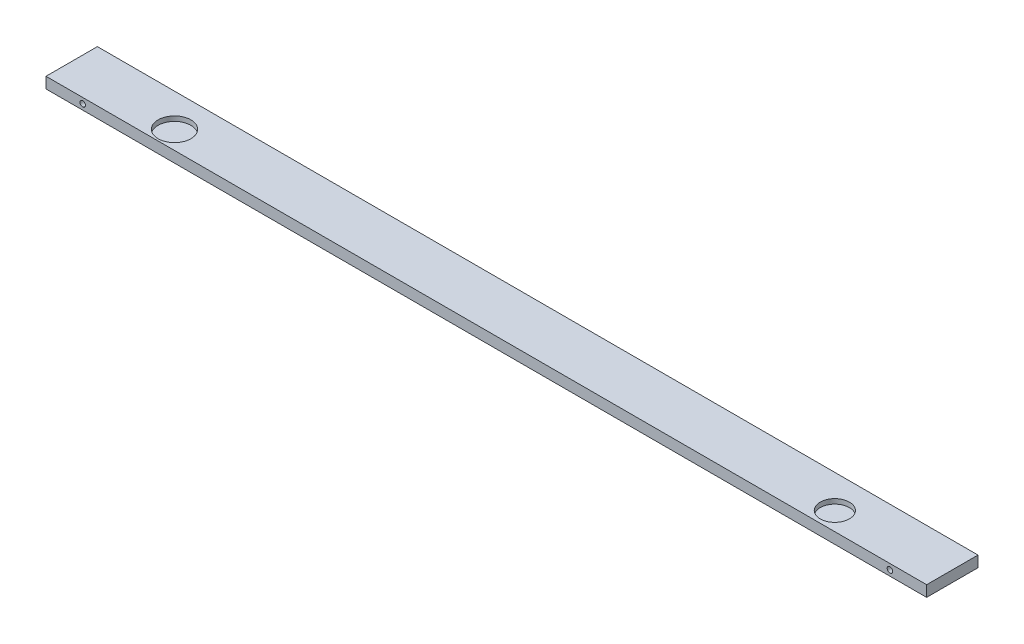
ISO-10303-21;
HEADER;
FILE_DESCRIPTION(('STEP AP214'),'2;1');
FILE_NAME('part.step','',(''),(''),'','','');
FILE_SCHEMA(('AUTOMOTIVE_DESIGN { 1 0 10303 214 1 1 1 1 }'));
ENDSEC;
DATA;
#1=APPLICATION_CONTEXT('core data for automotive mechanical design processes');
#2=APPLICATION_PROTOCOL_DEFINITION('international standard','automotive_design',2000,#1);
#3=PRODUCT_CONTEXT('',#1,'mechanical');
#4=PRODUCT('Part','Part','',(#3));
#5=PRODUCT_RELATED_PRODUCT_CATEGORY('part','',(#4));
#6=PRODUCT_DEFINITION_FORMATION('','',#4);
#7=PRODUCT_DEFINITION_CONTEXT('part definition',#1,'design');
#8=PRODUCT_DEFINITION('design','',#6,#7);
#9=PRODUCT_DEFINITION_SHAPE('','',#8);
#10=(LENGTH_UNIT() NAMED_UNIT(*) SI_UNIT(.MILLI.,.METRE.));
#11=(NAMED_UNIT(*) PLANE_ANGLE_UNIT() SI_UNIT($,.RADIAN.));
#12=(NAMED_UNIT(*) SI_UNIT($,.STERADIAN.) SOLID_ANGLE_UNIT());
#13=UNCERTAINTY_MEASURE_WITH_UNIT(LENGTH_MEASURE(1.E-05),#10,'distance_accuracy_value','');
#14=(GEOMETRIC_REPRESENTATION_CONTEXT(3) GLOBAL_UNCERTAINTY_ASSIGNED_CONTEXT((#13)) GLOBAL_UNIT_ASSIGNED_CONTEXT((#10,
#11,#12)) REPRESENTATION_CONTEXT('',''));
#15=CARTESIAN_POINT('',(0.,0.,0.));
#16=DIRECTION('',(0.,0.,1.));
#17=DIRECTION('',(1.,0.,0.));
#18=AXIS2_PLACEMENT_3D('',#15,#16,#17);
#19=CARTESIAN_POINT('',(120.,3.,-7.00000000000001));
#20=DIRECTION('',(0.,0.,1.));
#21=DIRECTION('',(1.,0.,0.));
#22=AXIS2_PLACEMENT_3D('',#19,#20,#21);
#23=PLANE('',#22);
#24=CARTESIAN_POINT('',(110.,1.5,-7.00000000000001));
#25=DIRECTION('',(0.,0.,-1.));
#26=DIRECTION('',(-1.,0.,0.));
#27=AXIS2_PLACEMENT_3D('',#24,#25,#26);
#28=CIRCLE('',#27,0.749999999999999);
#29=CARTESIAN_POINT('',(109.25,1.5,-7.00000000000001));
#30=VERTEX_POINT('',#29);
#31=EDGE_CURVE('E156',#30,#30,#28,.T.);
#32=ORIENTED_EDGE('',*,*,#31,.F.);
#33=EDGE_LOOP('',(#32));
#34=FACE_BOUND('',#33,.T.);
#35=CARTESIAN_POINT('',(-110.,1.5,-6.99999999999998));
#36=DIRECTION('',(0.,0.,-1.));
#37=DIRECTION('',(1.,0.,0.));
#38=AXIS2_PLACEMENT_3D('',#35,#36,#37);
#39=CIRCLE('',#38,0.749999999999999);
#40=CARTESIAN_POINT('',(-109.25,1.5,-6.99999999999998));
#41=VERTEX_POINT('',#40);
#42=EDGE_CURVE('E159',#41,#41,#39,.T.);
#43=ORIENTED_EDGE('',*,*,#42,.F.);
#44=EDGE_LOOP('',(#43));
#45=FACE_BOUND('',#44,.T.);
#46=DIRECTION('',(-1.,0.,0.));
#47=VECTOR('',#46,1.);
#48=CARTESIAN_POINT('',(120.,0.,-7.00000000000001));
#49=LINE('',#48,#47);
#50=CARTESIAN_POINT('',(120.,0.,-7.00000000000001));
#51=VERTEX_POINT('',#50);
#52=CARTESIAN_POINT('',(-120.,0.,-6.99999999999998));
#53=VERTEX_POINT('',#52);
#54=EDGE_CURVE('E112',#51,#53,#49,.T.);
#55=ORIENTED_EDGE('',*,*,#54,.T.);
#56=DIRECTION('',(0.,-1.,0.));
#57=VECTOR('',#56,1.);
#58=CARTESIAN_POINT('',(-120.,3.,-6.99999999999998));
#59=LINE('',#58,#57);
#60=CARTESIAN_POINT('',(-120.,3.,-6.99999999999998));
#61=VERTEX_POINT('',#60);
#62=EDGE_CURVE('E11',#61,#53,#59,.T.);
#63=ORIENTED_EDGE('',*,*,#62,.F.);
#64=DIRECTION('',(-1.,0.,0.));
#65=VECTOR('',#64,1.);
#66=CARTESIAN_POINT('',(120.,3.,-7.00000000000001));
#67=LINE('',#66,#65);
#68=CARTESIAN_POINT('',(120.,3.,-7.00000000000001));
#69=VERTEX_POINT('',#68);
#70=EDGE_CURVE('E85',#69,#61,#67,.T.);
#71=ORIENTED_EDGE('',*,*,#70,.F.);
#72=DIRECTION('',(0.,-1.,0.));
#73=VECTOR('',#72,1.);
#74=CARTESIAN_POINT('',(120.,3.,-7.00000000000001));
#75=LINE('',#74,#73);
#76=EDGE_CURVE('E108',#69,#51,#75,.T.);
#77=ORIENTED_EDGE('',*,*,#76,.T.);
#78=EDGE_LOOP('',(#55,#63,#71,#77));
#79=FACE_BOUND('',#78,.T.);
#80=ADVANCED_FACE('F45',(#34,#45,#79),#23,.F.);
#81=CARTESIAN_POINT('',(-120.,3.,7.00000000000002));
#82=DIRECTION('',(-1.,0.,0.));
#83=DIRECTION('',(0.,0.,1.));
#84=AXIS2_PLACEMENT_3D('',#81,#82,#83);
#85=PLANE('',#84);
#86=DIRECTION('',(0.,0.,-1.));
#87=VECTOR('',#86,1.);
#88=CARTESIAN_POINT('',(-120.,0.,7.00000000000002));
#89=LINE('',#88,#87);
#90=CARTESIAN_POINT('',(-120.,0.,7.00000000000002));
#91=VERTEX_POINT('',#90);
#92=EDGE_CURVE('E94',#91,#53,#89,.T.);
#93=ORIENTED_EDGE('',*,*,#92,.F.);
#94=DIRECTION('',(0.,-1.,0.));
#95=VECTOR('',#94,1.);
#96=CARTESIAN_POINT('',(-120.,3.,7.00000000000002));
#97=LINE('',#96,#95);
#98=CARTESIAN_POINT('',(-120.,3.,7.00000000000002));
#99=VERTEX_POINT('',#98);
#100=EDGE_CURVE('E54',#99,#91,#97,.T.);
#101=ORIENTED_EDGE('',*,*,#100,.F.);
#102=DIRECTION('',(0.,0.,-1.));
#103=VECTOR('',#102,1.);
#104=CARTESIAN_POINT('',(-120.,3.,7.00000000000002));
#105=LINE('',#104,#103);
#106=EDGE_CURVE('E92',#99,#61,#105,.T.);
#107=ORIENTED_EDGE('',*,*,#106,.T.);
#108=ORIENTED_EDGE('',*,*,#62,.T.);
#109=EDGE_LOOP('',(#93,#101,#107,#108));
#110=FACE_BOUND('',#109,.T.);
#111=ADVANCED_FACE('F91',(#110),#85,.T.);
#112=CARTESIAN_POINT('',(120.,3.,6.99999999999999));
#113=DIRECTION('',(0.,0.,1.));
#114=DIRECTION('',(1.,0.,0.));
#115=AXIS2_PLACEMENT_3D('',#112,#113,#114);
#116=PLANE('',#115);
#117=CARTESIAN_POINT('',(110.,1.5,7.00000000000002));
#118=DIRECTION('',(0.,0.,-1.));
#119=DIRECTION('',(-1.,0.,0.));
#120=AXIS2_PLACEMENT_3D('',#117,#118,#119);
#121=CIRCLE('',#120,0.749999999999999);
#122=CARTESIAN_POINT('',(109.25,1.5,7.00000000000002));
#123=VERTEX_POINT('',#122);
#124=EDGE_CURVE('E166',#123,#123,#121,.T.);
#125=ORIENTED_EDGE('',*,*,#124,.T.);
#126=EDGE_LOOP('',(#125));
#127=FACE_BOUND('',#126,.T.);
#128=CARTESIAN_POINT('',(-110.,1.5,7.00000000000004));
#129=DIRECTION('',(0.,0.,-1.));
#130=DIRECTION('',(1.,0.,0.));
#131=AXIS2_PLACEMENT_3D('',#128,#129,#130);
#132=CIRCLE('',#131,0.749999999999999);
#133=CARTESIAN_POINT('',(-109.25,1.5,7.00000000000004));
#134=VERTEX_POINT('',#133);
#135=EDGE_CURVE('E162',#134,#134,#132,.T.);
#136=ORIENTED_EDGE('',*,*,#135,.T.);
#137=EDGE_LOOP('',(#136));
#138=FACE_BOUND('',#137,.T.);
#139=DIRECTION('',(-1.,0.,0.));
#140=VECTOR('',#139,1.);
#141=CARTESIAN_POINT('',(120.,0.,6.99999999999999));
#142=LINE('',#141,#140);
#143=CARTESIAN_POINT('',(120.,0.,6.99999999999999));
#144=VERTEX_POINT('',#143);
#145=EDGE_CURVE('E119',#144,#91,#142,.T.);
#146=ORIENTED_EDGE('',*,*,#145,.F.);
#147=DIRECTION('',(0.,-1.,0.));
#148=VECTOR('',#147,1.);
#149=CARTESIAN_POINT('',(120.,3.,6.99999999999999));
#150=LINE('',#149,#148);
#151=CARTESIAN_POINT('',(120.,3.,6.99999999999999));
#152=VERTEX_POINT('',#151);
#153=EDGE_CURVE('E77',#152,#144,#150,.T.);
#154=ORIENTED_EDGE('',*,*,#153,.F.);
#155=DIRECTION('',(-1.,0.,0.));
#156=VECTOR('',#155,1.);
#157=CARTESIAN_POINT('',(120.,3.,6.99999999999999));
#158=LINE('',#157,#156);
#159=EDGE_CURVE('E101',#152,#99,#158,.T.);
#160=ORIENTED_EDGE('',*,*,#159,.T.);
#161=ORIENTED_EDGE('',*,*,#100,.T.);
#162=EDGE_LOOP('',(#146,#154,#160,#161));
#163=FACE_BOUND('',#162,.T.);
#164=ADVANCED_FACE('F104',(#127,#138,#163),#116,.T.);
#165=CARTESIAN_POINT('',(120.,3.,6.99999999999999));
#166=DIRECTION('',(-1.,0.,0.));
#167=DIRECTION('',(0.,0.,1.));
#168=AXIS2_PLACEMENT_3D('',#165,#166,#167);
#169=PLANE('',#168);
#170=DIRECTION('',(0.,0.,-1.));
#171=VECTOR('',#170,1.);
#172=CARTESIAN_POINT('',(120.,0.,6.99999999999999));
#173=LINE('',#172,#171);
#174=EDGE_CURVE('E80',#144,#51,#173,.T.);
#175=ORIENTED_EDGE('',*,*,#174,.T.);
#176=ORIENTED_EDGE('',*,*,#76,.F.);
#177=DIRECTION('',(0.,0.,-1.));
#178=VECTOR('',#177,1.);
#179=CARTESIAN_POINT('',(120.,3.,6.99999999999999));
#180=LINE('',#179,#178);
#181=EDGE_CURVE('E62',#152,#69,#180,.T.);
#182=ORIENTED_EDGE('',*,*,#181,.F.);
#183=ORIENTED_EDGE('',*,*,#153,.T.);
#184=EDGE_LOOP('',(#175,#176,#182,#183));
#185=FACE_BOUND('',#184,.T.);
#186=ADVANCED_FACE('F142',(#185),#169,.F.);
#187=CARTESIAN_POINT('',(0.,3.,0.));
#188=DIRECTION('',(0.,-1.,0.));
#189=DIRECTION('',(0.,0.,-1.));
#190=AXIS2_PLACEMENT_3D('',#187,#188,#189);
#191=PLANE('',#190);
#192=CARTESIAN_POINT('',(-89.9777750336159,3.,1.99999999999999));
#193=DIRECTION('',(0.,1.,0.));
#194=DIRECTION('',(0.,0.,1.));
#195=AXIS2_PLACEMENT_3D('',#192,#193,#194);
#196=CIRCLE('',#195,4.46630642263213);
#197=CARTESIAN_POINT('',(-89.9777750336159,3.,6.46630642263212));
#198=VERTEX_POINT('',#197);
#199=EDGE_CURVE('E175',#198,#198,#196,.T.);
#200=ORIENTED_EDGE('',*,*,#199,.F.);
#201=EDGE_LOOP('',(#200));
#202=FACE_BOUND('',#201,.T.);
#203=CARTESIAN_POINT('',(89.9777750336159,3.,1.99999999999999));
#204=DIRECTION('',(0.,1.,0.));
#205=DIRECTION('',(0.,0.,1.));
#206=AXIS2_PLACEMENT_3D('',#203,#204,#205);
#207=CIRCLE('',#206,3.97005015345081);
#208=CARTESIAN_POINT('',(89.9777750336159,3.,5.9700501534508));
#209=VERTEX_POINT('',#208);
#210=EDGE_CURVE('E179',#209,#209,#207,.T.);
#211=ORIENTED_EDGE('',*,*,#210,.F.);
#212=EDGE_LOOP('',(#211));
#213=FACE_BOUND('',#212,.T.);
#214=ORIENTED_EDGE('',*,*,#70,.T.);
#215=ORIENTED_EDGE('',*,*,#106,.F.);
#216=ORIENTED_EDGE('',*,*,#159,.F.);
#217=ORIENTED_EDGE('',*,*,#181,.T.);
#218=EDGE_LOOP('',(#214,#215,#216,#217));
#219=FACE_BOUND('',#218,.T.);
#220=ADVANCED_FACE('F100',(#202,#213,#219),#191,.F.);
#221=CARTESIAN_POINT('',(0.,0.,0.));
#222=DIRECTION('',(0.,-1.,0.));
#223=DIRECTION('',(0.,0.,-1.));
#224=AXIS2_PLACEMENT_3D('',#221,#222,#223);
#225=PLANE('',#224);
#226=ORIENTED_EDGE('',*,*,#54,.F.);
#227=ORIENTED_EDGE('',*,*,#174,.F.);
#228=ORIENTED_EDGE('',*,*,#145,.T.);
#229=ORIENTED_EDGE('',*,*,#92,.T.);
#230=EDGE_LOOP('',(#226,#227,#228,#229));
#231=FACE_BOUND('',#230,.T.);
#232=ADVANCED_FACE('F130',(#231),#225,.T.);
#233=CARTESIAN_POINT('',(89.9777750336159,1.7,1.99999999999999));
#234=DIRECTION('',(0.,1.,0.));
#235=DIRECTION('',(0.,0.,1.));
#236=AXIS2_PLACEMENT_3D('',#233,#234,#235);
#237=CYLINDRICAL_SURFACE('',#236,3.97005015345081);
#238=CARTESIAN_POINT('',(89.9777750336159,1.7,1.99999999999999));
#239=DIRECTION('',(0.,1.,0.));
#240=DIRECTION('',(0.,0.,1.));
#241=AXIS2_PLACEMENT_3D('',#238,#239,#240);
#242=CIRCLE('',#241,3.97005015345081);
#243=CARTESIAN_POINT('',(89.9777750336159,1.7,5.9700501534508));
#244=VERTEX_POINT('',#243);
#245=EDGE_CURVE('E183',#244,#244,#242,.T.);
#246=ORIENTED_EDGE('',*,*,#245,.F.);
#247=EDGE_LOOP('',(#246));
#248=FACE_BOUND('',#247,.T.);
#249=ORIENTED_EDGE('',*,*,#210,.T.);
#250=EDGE_LOOP('',(#249));
#251=FACE_BOUND('',#250,.T.);
#252=ADVANCED_FACE('F132',(#248,#251),#237,.F.);
#253=CARTESIAN_POINT('',(89.9777750336159,1.7,1.99999999999999));
#254=DIRECTION('',(0.,1.,0.));
#255=DIRECTION('',(0.,0.,1.));
#256=AXIS2_PLACEMENT_3D('',#253,#254,#255);
#257=PLANE('',#256);
#258=ORIENTED_EDGE('',*,*,#245,.T.);
#259=EDGE_LOOP('',(#258));
#260=FACE_BOUND('',#259,.T.);
#261=ADVANCED_FACE('F139',(#260),#257,.T.);
#262=CARTESIAN_POINT('',(-89.9777750336159,1.7,1.99999999999999));
#263=DIRECTION('',(0.,1.,0.));
#264=DIRECTION('',(0.,0.,1.));
#265=AXIS2_PLACEMENT_3D('',#262,#263,#264);
#266=CYLINDRICAL_SURFACE('',#265,4.46630642263213);
#267=CARTESIAN_POINT('',(-89.9777750336159,1.7,1.99999999999999));
#268=DIRECTION('',(0.,1.,0.));
#269=DIRECTION('',(0.,0.,1.));
#270=AXIS2_PLACEMENT_3D('',#267,#268,#269);
#271=CIRCLE('',#270,4.46630642263213);
#272=CARTESIAN_POINT('',(-89.9777750336159,1.7,6.46630642263212));
#273=VERTEX_POINT('',#272);
#274=EDGE_CURVE('E116',#273,#273,#271,.T.);
#275=ORIENTED_EDGE('',*,*,#274,.F.);
#276=EDGE_LOOP('',(#275));
#277=FACE_BOUND('',#276,.T.);
#278=ORIENTED_EDGE('',*,*,#199,.T.);
#279=EDGE_LOOP('',(#278));
#280=FACE_BOUND('',#279,.T.);
#281=ADVANCED_FACE('F206',(#277,#280),#266,.F.);
#282=CARTESIAN_POINT('',(-89.9777750336159,1.7,1.99999999999999));
#283=DIRECTION('',(0.,1.,0.));
#284=DIRECTION('',(0.,0.,1.));
#285=AXIS2_PLACEMENT_3D('',#282,#283,#284);
#286=PLANE('',#285);
#287=ORIENTED_EDGE('',*,*,#274,.T.);
#288=EDGE_LOOP('',(#287));
#289=FACE_BOUND('',#288,.T.);
#290=ADVANCED_FACE('F201',(#289),#286,.T.);
#291=CARTESIAN_POINT('',(-110.,1.5,7.00000000000004));
#292=DIRECTION('',(0.,0.,-1.));
#293=DIRECTION('',(-1.,0.,0.));
#294=AXIS2_PLACEMENT_3D('',#291,#292,#293);
#295=CYLINDRICAL_SURFACE('',#294,0.749999999999999);
#296=ORIENTED_EDGE('',*,*,#135,.F.);
#297=EDGE_LOOP('',(#296));
#298=FACE_BOUND('',#297,.T.);
#299=ORIENTED_EDGE('',*,*,#42,.T.);
#300=EDGE_LOOP('',(#299));
#301=FACE_BOUND('',#300,.T.);
#302=ADVANCED_FACE('F196',(#298,#301),#295,.F.);
#303=CARTESIAN_POINT('',(110.,1.5,7.00000000000002));
#304=DIRECTION('',(0.,0.,-1.));
#305=DIRECTION('',(-1.,0.,0.));
#306=AXIS2_PLACEMENT_3D('',#303,#304,#305);
#307=CYLINDRICAL_SURFACE('',#306,0.749999999999999);
#308=ORIENTED_EDGE('',*,*,#124,.F.);
#309=EDGE_LOOP('',(#308));
#310=FACE_BOUND('',#309,.T.);
#311=ORIENTED_EDGE('',*,*,#31,.T.);
#312=EDGE_LOOP('',(#311));
#313=FACE_BOUND('',#312,.T.);
#314=ADVANCED_FACE('F193',(#310,#313),#307,.F.);
#315=CLOSED_SHELL('',(#80,#111,#164,#186,#220,#232,#252,#261,#281,#290,#302,#314));
#316=MANIFOLD_SOLID_BREP('B2',#315);
#317=ADVANCED_BREP_SHAPE_REPRESENTATION('',(#18,#316),#14);
#318=SHAPE_DEFINITION_REPRESENTATION(#9,#317);
ENDSEC;
END-ISO-10303-21;
